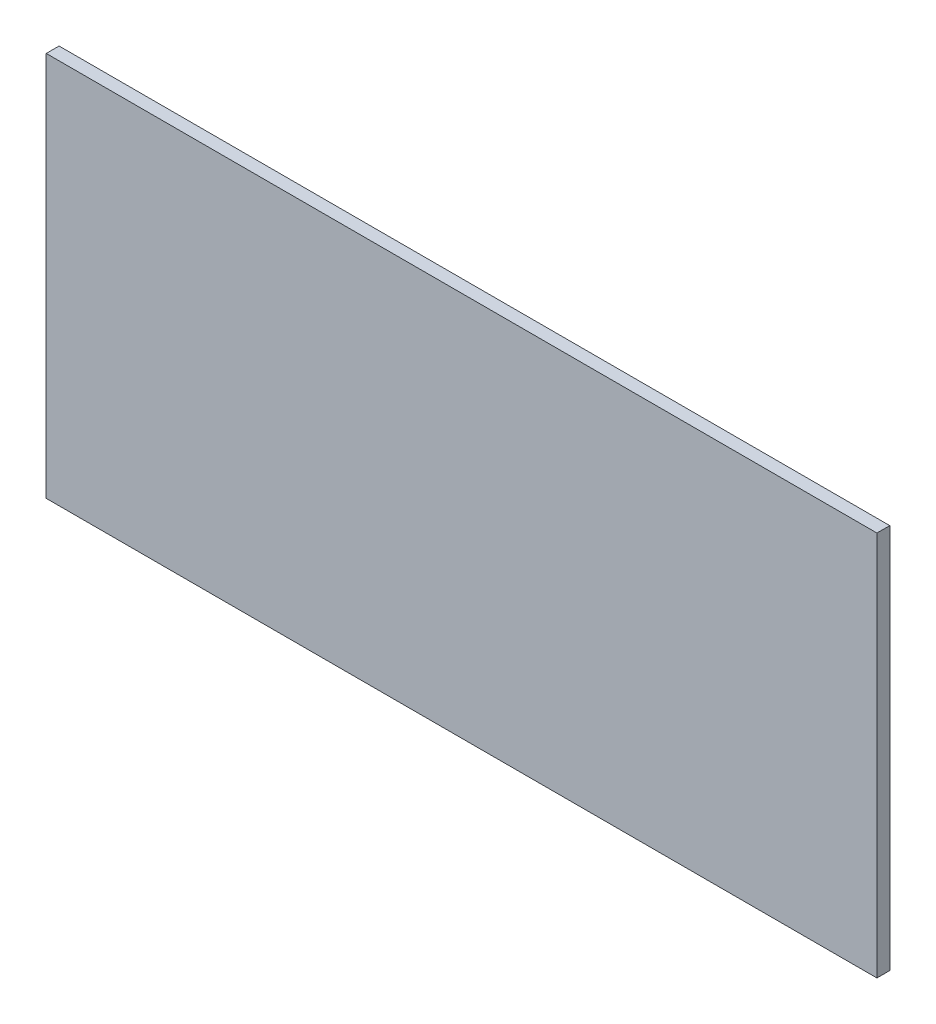
ISO-10303-21;
HEADER;
FILE_DESCRIPTION(('STEP AP214'),'2;1');
FILE_NAME('part.step','',(''),(''),'','','');
FILE_SCHEMA(('AUTOMOTIVE_DESIGN { 1 0 10303 214 1 1 1 1 }'));
ENDSEC;
DATA;
#1=APPLICATION_CONTEXT('core data for automotive mechanical design processes');
#2=APPLICATION_PROTOCOL_DEFINITION('international standard','automotive_design',2000,#1);
#3=PRODUCT_CONTEXT('',#1,'mechanical');
#4=PRODUCT('Part','Part','',(#3));
#5=PRODUCT_RELATED_PRODUCT_CATEGORY('part','',(#4));
#6=PRODUCT_DEFINITION_FORMATION('','',#4);
#7=PRODUCT_DEFINITION_CONTEXT('part definition',#1,'design');
#8=PRODUCT_DEFINITION('design','',#6,#7);
#9=PRODUCT_DEFINITION_SHAPE('','',#8);
#10=(LENGTH_UNIT() NAMED_UNIT(*) SI_UNIT(.MILLI.,.METRE.));
#11=(NAMED_UNIT(*) PLANE_ANGLE_UNIT() SI_UNIT($,.RADIAN.));
#12=(NAMED_UNIT(*) SI_UNIT($,.STERADIAN.) SOLID_ANGLE_UNIT());
#13=UNCERTAINTY_MEASURE_WITH_UNIT(LENGTH_MEASURE(1.E-05),#10,'distance_accuracy_value','');
#14=(GEOMETRIC_REPRESENTATION_CONTEXT(3) GLOBAL_UNCERTAINTY_ASSIGNED_CONTEXT((#13)) GLOBAL_UNIT_ASSIGNED_CONTEXT((#10,
#11,#12)) REPRESENTATION_CONTEXT('',''));
#15=CARTESIAN_POINT('',(0.,0.,0.));
#16=DIRECTION('',(0.,0.,1.));
#17=DIRECTION('',(1.,0.,0.));
#18=AXIS2_PLACEMENT_3D('',#15,#16,#17);
#19=CARTESIAN_POINT('',(-100.,45.,3.));
#20=DIRECTION('',(1.,0.,0.));
#21=DIRECTION('',(0.,0.,-1.));
#22=AXIS2_PLACEMENT_3D('',#19,#20,#21);
#23=PLANE('',#22);
#24=DIRECTION('',(0.,-1.,0.));
#25=VECTOR('',#24,1.);
#26=CARTESIAN_POINT('',(-100.,45.,0.));
#27=LINE('',#26,#25);
#28=CARTESIAN_POINT('',(-100.,45.,0.));
#29=VERTEX_POINT('',#28);
#30=CARTESIAN_POINT('',(-100.,-45.,0.));
#31=VERTEX_POINT('',#30);
#32=EDGE_CURVE('E107',#29,#31,#27,.T.);
#33=ORIENTED_EDGE('',*,*,#32,.T.);
#34=DIRECTION('',(0.,0.,-1.));
#35=VECTOR('',#34,1.);
#36=CARTESIAN_POINT('',(-100.,-45.,3.));
#37=LINE('',#36,#35);
#38=CARTESIAN_POINT('',(-100.,-45.,3.));
#39=VERTEX_POINT('',#38);
#40=EDGE_CURVE('E11',#39,#31,#37,.T.);
#41=ORIENTED_EDGE('',*,*,#40,.F.);
#42=DIRECTION('',(0.,-1.,0.));
#43=VECTOR('',#42,1.);
#44=CARTESIAN_POINT('',(-100.,45.,3.));
#45=LINE('',#44,#43);
#46=CARTESIAN_POINT('',(-100.,45.,3.));
#47=VERTEX_POINT('',#46);
#48=EDGE_CURVE('E91',#47,#39,#45,.T.);
#49=ORIENTED_EDGE('',*,*,#48,.F.);
#50=DIRECTION('',(0.,0.,-1.));
#51=VECTOR('',#50,1.);
#52=CARTESIAN_POINT('',(-100.,45.,3.));
#53=LINE('',#52,#51);
#54=EDGE_CURVE('E103',#47,#29,#53,.T.);
#55=ORIENTED_EDGE('',*,*,#54,.T.);
#56=EDGE_LOOP('',(#33,#41,#49,#55));
#57=FACE_BOUND('',#56,.T.);
#58=ADVANCED_FACE('F39',(#57),#23,.F.);
#59=CARTESIAN_POINT('',(-100.,-45.,3.));
#60=DIRECTION('',(0.,1.,0.));
#61=DIRECTION('',(0.,0.,1.));
#62=AXIS2_PLACEMENT_3D('',#59,#60,#61);
#63=PLANE('',#62);
#64=DIRECTION('',(1.,0.,0.));
#65=VECTOR('',#64,1.);
#66=CARTESIAN_POINT('',(-100.,-45.,0.));
#67=LINE('',#66,#65);
#68=CARTESIAN_POINT('',(94.,-45.,0.));
#69=VERTEX_POINT('',#68);
#70=EDGE_CURVE('E96',#31,#69,#67,.T.);
#71=ORIENTED_EDGE('',*,*,#70,.T.);
#72=DIRECTION('',(0.,0.,-1.));
#73=VECTOR('',#72,1.);
#74=CARTESIAN_POINT('',(94.,-45.,3.));
#75=LINE('',#74,#73);
#76=CARTESIAN_POINT('',(94.,-45.,3.));
#77=VERTEX_POINT('',#76);
#78=EDGE_CURVE('E48',#77,#69,#75,.T.);
#79=ORIENTED_EDGE('',*,*,#78,.F.);
#80=DIRECTION('',(1.,0.,0.));
#81=VECTOR('',#80,1.);
#82=CARTESIAN_POINT('',(-100.,-45.,3.));
#83=LINE('',#82,#81);
#84=EDGE_CURVE('E86',#39,#77,#83,.T.);
#85=ORIENTED_EDGE('',*,*,#84,.F.);
#86=ORIENTED_EDGE('',*,*,#40,.T.);
#87=EDGE_LOOP('',(#71,#79,#85,#86));
#88=FACE_BOUND('',#87,.T.);
#89=ADVANCED_FACE('F95',(#88),#63,.F.);
#90=CARTESIAN_POINT('',(94.,45.,3.));
#91=DIRECTION('',(-1.,0.,0.));
#92=DIRECTION('',(0.,-1.,0.));
#93=AXIS2_PLACEMENT_3D('',#90,#91,#92);
#94=PLANE('',#93);
#95=DIRECTION('',(0.,1.,0.));
#96=VECTOR('',#95,1.);
#97=CARTESIAN_POINT('',(94.,45.,0.));
#98=LINE('',#97,#96);
#99=CARTESIAN_POINT('',(94.,45.,0.));
#100=VERTEX_POINT('',#99);
#101=EDGE_CURVE('E73',#69,#100,#98,.T.);
#102=ORIENTED_EDGE('',*,*,#101,.T.);
#103=DIRECTION('',(0.,0.,-1.));
#104=VECTOR('',#103,1.);
#105=CARTESIAN_POINT('',(94.,45.,3.));
#106=LINE('',#105,#104);
#107=CARTESIAN_POINT('',(94.,45.,3.));
#108=VERTEX_POINT('',#107);
#109=EDGE_CURVE('E98',#108,#100,#106,.T.);
#110=ORIENTED_EDGE('',*,*,#109,.F.);
#111=DIRECTION('',(0.,1.,0.));
#112=VECTOR('',#111,1.);
#113=CARTESIAN_POINT('',(94.,45.,3.));
#114=LINE('',#113,#112);
#115=EDGE_CURVE('E89',#77,#108,#114,.T.);
#116=ORIENTED_EDGE('',*,*,#115,.F.);
#117=ORIENTED_EDGE('',*,*,#78,.T.);
#118=EDGE_LOOP('',(#102,#110,#116,#117));
#119=FACE_BOUND('',#118,.T.);
#120=ADVANCED_FACE('F99',(#119),#94,.F.);
#121=CARTESIAN_POINT('',(-100.,45.,3.));
#122=DIRECTION('',(0.,-1.,0.));
#123=DIRECTION('',(0.,0.,-1.));
#124=AXIS2_PLACEMENT_3D('',#121,#122,#123);
#125=PLANE('',#124);
#126=DIRECTION('',(-1.,0.,0.));
#127=VECTOR('',#126,1.);
#128=CARTESIAN_POINT('',(-100.,45.,0.));
#129=LINE('',#128,#127);
#130=EDGE_CURVE('E79',#100,#29,#129,.T.);
#131=ORIENTED_EDGE('',*,*,#130,.T.);
#132=ORIENTED_EDGE('',*,*,#54,.F.);
#133=DIRECTION('',(-1.,0.,0.));
#134=VECTOR('',#133,1.);
#135=CARTESIAN_POINT('',(-100.,45.,3.));
#136=LINE('',#135,#134);
#137=EDGE_CURVE('E56',#108,#47,#136,.T.);
#138=ORIENTED_EDGE('',*,*,#137,.F.);
#139=ORIENTED_EDGE('',*,*,#109,.T.);
#140=EDGE_LOOP('',(#131,#132,#138,#139));
#141=FACE_BOUND('',#140,.T.);
#142=ADVANCED_FACE('F120',(#141),#125,.F.);
#143=CARTESIAN_POINT('',(0.,0.,3.));
#144=DIRECTION('',(0.,0.,1.));
#145=DIRECTION('',(1.,0.,0.));
#146=AXIS2_PLACEMENT_3D('',#143,#144,#145);
#147=PLANE('',#146);
#148=ORIENTED_EDGE('',*,*,#48,.T.);
#149=ORIENTED_EDGE('',*,*,#84,.T.);
#150=ORIENTED_EDGE('',*,*,#115,.T.);
#151=ORIENTED_EDGE('',*,*,#137,.T.);
#152=EDGE_LOOP('',(#148,#149,#150,#151));
#153=FACE_BOUND('',#152,.T.);
#154=ADVANCED_FACE('F87',(#153),#147,.T.);
#155=CARTESIAN_POINT('',(0.,0.,0.));
#156=DIRECTION('',(0.,0.,1.));
#157=DIRECTION('',(1.,0.,0.));
#158=AXIS2_PLACEMENT_3D('',#155,#156,#157);
#159=PLANE('',#158);
#160=ORIENTED_EDGE('',*,*,#32,.F.);
#161=ORIENTED_EDGE('',*,*,#130,.F.);
#162=ORIENTED_EDGE('',*,*,#101,.F.);
#163=ORIENTED_EDGE('',*,*,#70,.F.);
#164=EDGE_LOOP('',(#160,#161,#162,#163));
#165=FACE_BOUND('',#164,.T.);
#166=ADVANCED_FACE('F123',(#165),#159,.F.);
#167=CLOSED_SHELL('',(#58,#89,#120,#142,#154,#166));
#168=MANIFOLD_SOLID_BREP('B2',#167);
#169=ADVANCED_BREP_SHAPE_REPRESENTATION('',(#18,#168),#14);
#170=SHAPE_DEFINITION_REPRESENTATION(#9,#169);
ENDSEC;
END-ISO-10303-21;
